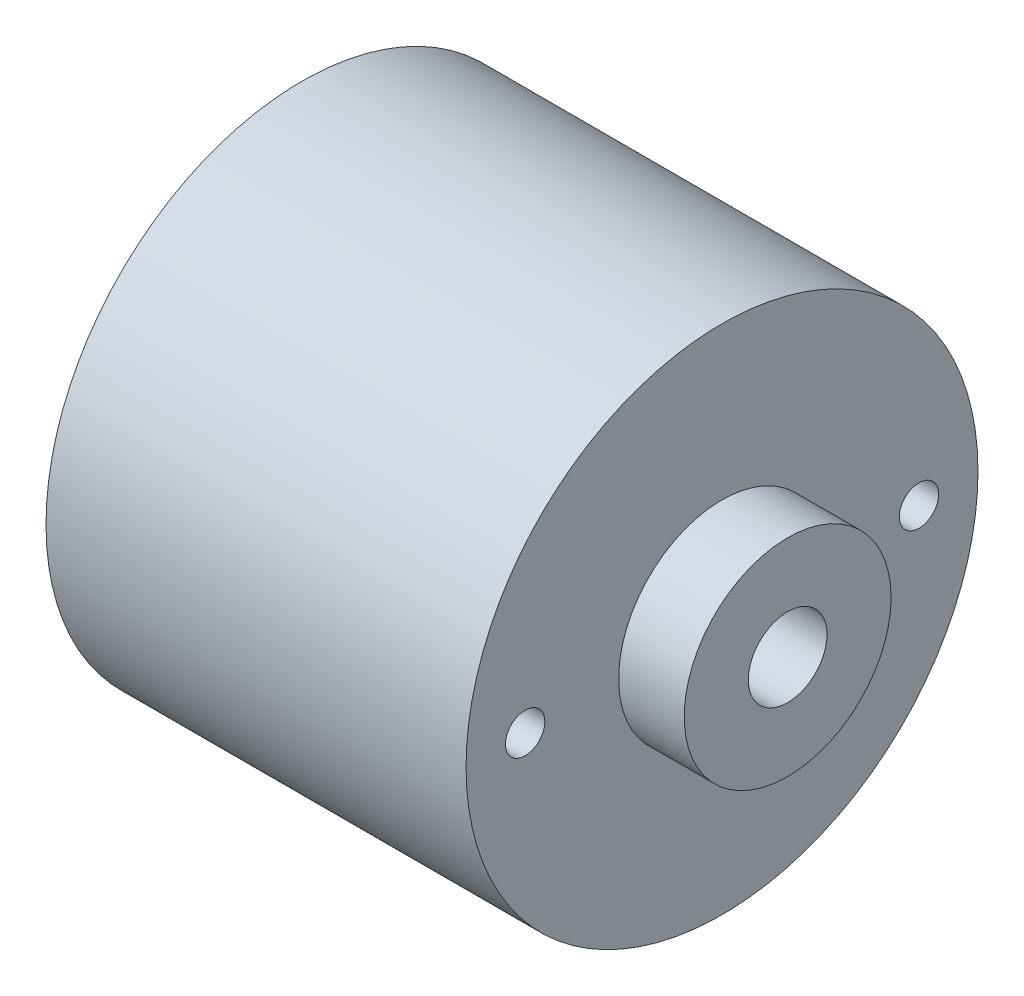
ISO-10303-21;
HEADER;
FILE_DESCRIPTION(('STEP AP214'),'2;1');
FILE_NAME('part.step','',(''),(''),'','','');
FILE_SCHEMA(('AUTOMOTIVE_DESIGN { 1 0 10303 214 1 1 1 1 }'));
ENDSEC;
DATA;
#1=APPLICATION_CONTEXT('core data for automotive mechanical design processes');
#2=APPLICATION_PROTOCOL_DEFINITION('international standard','automotive_design',2000,#1);
#3=PRODUCT_CONTEXT('',#1,'mechanical');
#4=PRODUCT('Part','Part','',(#3));
#5=PRODUCT_RELATED_PRODUCT_CATEGORY('part','',(#4));
#6=PRODUCT_DEFINITION_FORMATION('','',#4);
#7=PRODUCT_DEFINITION_CONTEXT('part definition',#1,'design');
#8=PRODUCT_DEFINITION('design','',#6,#7);
#9=PRODUCT_DEFINITION_SHAPE('','',#8);
#10=(LENGTH_UNIT() NAMED_UNIT(*) SI_UNIT(.MILLI.,.METRE.));
#11=(NAMED_UNIT(*) PLANE_ANGLE_UNIT() SI_UNIT($,.RADIAN.));
#12=(NAMED_UNIT(*) SI_UNIT($,.STERADIAN.) SOLID_ANGLE_UNIT());
#13=UNCERTAINTY_MEASURE_WITH_UNIT(LENGTH_MEASURE(1.E-05),#10,'distance_accuracy_value','');
#14=(GEOMETRIC_REPRESENTATION_CONTEXT(3) GLOBAL_UNCERTAINTY_ASSIGNED_CONTEXT((#13)) GLOBAL_UNIT_ASSIGNED_CONTEXT((#10,
#11,#12)) REPRESENTATION_CONTEXT('',''));
#15=CARTESIAN_POINT('',(0.,0.,0.));
#16=DIRECTION('',(0.,0.,1.));
#17=DIRECTION('',(1.,0.,0.));
#18=AXIS2_PLACEMENT_3D('',#15,#16,#17);
#19=CARTESIAN_POINT('',(32.,0.,0.));
#20=DIRECTION('',(-1.,0.,0.));
#21=DIRECTION('',(0.,0.,1.));
#22=AXIS2_PLACEMENT_3D('',#19,#20,#21);
#23=CYLINDRICAL_SURFACE('',#22,19.5);
#24=CARTESIAN_POINT('',(32.,0.,0.));
#25=DIRECTION('',(1.,0.,0.));
#26=DIRECTION('',(0.,0.,-1.));
#27=AXIS2_PLACEMENT_3D('',#24,#25,#26);
#28=CIRCLE('',#27,19.5);
#29=CARTESIAN_POINT('',(32.,0.,-19.5));
#30=VERTEX_POINT('',#29);
#31=EDGE_CURVE('E42',#30,#30,#28,.T.);
#32=ORIENTED_EDGE('',*,*,#31,.F.);
#33=EDGE_LOOP('',(#32));
#34=FACE_BOUND('',#33,.T.);
#35=CARTESIAN_POINT('',(0.,0.,0.));
#36=DIRECTION('',(1.,0.,0.));
#37=DIRECTION('',(0.,0.,-1.));
#38=AXIS2_PLACEMENT_3D('',#35,#36,#37);
#39=CIRCLE('',#38,19.5);
#40=CARTESIAN_POINT('',(0.,0.,-19.5));
#41=VERTEX_POINT('',#40);
#42=EDGE_CURVE('E38',#41,#41,#39,.T.);
#43=ORIENTED_EDGE('',*,*,#42,.T.);
#44=EDGE_LOOP('',(#43));
#45=FACE_BOUND('',#44,.T.);
#46=ADVANCED_FACE('F35',(#34,#45),#23,.T.);
#47=CARTESIAN_POINT('',(32.,0.,0.));
#48=DIRECTION('',(1.,0.,0.));
#49=DIRECTION('',(0.,0.,-1.));
#50=AXIS2_PLACEMENT_3D('',#47,#48,#49);
#51=PLANE('',#50);
#52=CARTESIAN_POINT('',(32.,0.,-15.));
#53=DIRECTION('',(1.,0.,0.));
#54=DIRECTION('',(0.,0.,-1.));
#55=AXIS2_PLACEMENT_3D('',#52,#53,#54);
#56=CIRCLE('',#55,1.5);
#57=CARTESIAN_POINT('',(32.,0.,-16.5));
#58=VERTEX_POINT('',#57);
#59=EDGE_CURVE('E64',#58,#58,#56,.T.);
#60=ORIENTED_EDGE('',*,*,#59,.F.);
#61=EDGE_LOOP('',(#60));
#62=FACE_BOUND('',#61,.T.);
#63=CARTESIAN_POINT('',(32.,0.,15.));
#64=DIRECTION('',(1.,0.,0.));
#65=DIRECTION('',(0.,0.,-1.));
#66=AXIS2_PLACEMENT_3D('',#63,#64,#65);
#67=CIRCLE('',#66,1.5);
#68=CARTESIAN_POINT('',(32.,0.,13.5));
#69=VERTEX_POINT('',#68);
#70=EDGE_CURVE('E58',#69,#69,#67,.T.);
#71=ORIENTED_EDGE('',*,*,#70,.F.);
#72=EDGE_LOOP('',(#71));
#73=FACE_BOUND('',#72,.T.);
#74=CARTESIAN_POINT('',(32.,0.,0.));
#75=DIRECTION('',(1.,0.,0.));
#76=DIRECTION('',(0.,0.,-1.));
#77=AXIS2_PLACEMENT_3D('',#74,#75,#76);
#78=CIRCLE('',#77,7.88);
#79=CARTESIAN_POINT('',(32.,0.,-7.88));
#80=VERTEX_POINT('',#79);
#81=EDGE_CURVE('E10',#80,#80,#78,.T.);
#82=ORIENTED_EDGE('',*,*,#81,.F.);
#83=EDGE_LOOP('',(#82));
#84=FACE_BOUND('',#83,.T.);
#85=ORIENTED_EDGE('',*,*,#31,.T.);
#86=EDGE_LOOP('',(#85));
#87=FACE_BOUND('',#86,.T.);
#88=ADVANCED_FACE('F79',(#62,#73,#84,#87),#51,.T.);
#89=CARTESIAN_POINT('',(0.,0.,0.));
#90=DIRECTION('',(1.,0.,0.));
#91=DIRECTION('',(0.,0.,-1.));
#92=AXIS2_PLACEMENT_3D('',#89,#90,#91);
#93=PLANE('',#92);
#94=CARTESIAN_POINT('',(0.,0.,0.));
#95=DIRECTION('',(1.,0.,0.));
#96=DIRECTION('',(0.,0.,-1.));
#97=AXIS2_PLACEMENT_3D('',#94,#95,#96);
#98=CIRCLE('',#97,3.);
#99=CARTESIAN_POINT('',(0.,0.,-3.));
#100=VERTEX_POINT('',#99);
#101=EDGE_CURVE('E51',#100,#100,#98,.F.);
#102=ORIENTED_EDGE('',*,*,#101,.F.);
#103=EDGE_LOOP('',(#102));
#104=FACE_BOUND('',#103,.T.);
#105=ORIENTED_EDGE('',*,*,#42,.F.);
#106=EDGE_LOOP('',(#105));
#107=FACE_BOUND('',#106,.T.);
#108=ADVANCED_FACE('F82',(#104,#107),#93,.F.);
#109=CARTESIAN_POINT('',(37.,0.,0.));
#110=DIRECTION('',(-1.,0.,0.));
#111=DIRECTION('',(0.,0.,1.));
#112=AXIS2_PLACEMENT_3D('',#109,#110,#111);
#113=CYLINDRICAL_SURFACE('',#112,7.88);
#114=CARTESIAN_POINT('',(37.,0.,0.));
#115=DIRECTION('',(1.,0.,0.));
#116=DIRECTION('',(0.,0.,-1.));
#117=AXIS2_PLACEMENT_3D('',#114,#115,#116);
#118=CIRCLE('',#117,7.88);
#119=CARTESIAN_POINT('',(37.,0.,-7.88));
#120=VERTEX_POINT('',#119);
#121=EDGE_CURVE('E48',#120,#120,#118,.T.);
#122=ORIENTED_EDGE('',*,*,#121,.F.);
#123=EDGE_LOOP('',(#122));
#124=FACE_BOUND('',#123,.T.);
#125=ORIENTED_EDGE('',*,*,#81,.T.);
#126=EDGE_LOOP('',(#125));
#127=FACE_BOUND('',#126,.T.);
#128=ADVANCED_FACE('F95',(#124,#127),#113,.T.);
#129=CARTESIAN_POINT('',(37.,0.,0.));
#130=DIRECTION('',(1.,0.,0.));
#131=DIRECTION('',(0.,0.,-1.));
#132=AXIS2_PLACEMENT_3D('',#129,#130,#131);
#133=PLANE('',#132);
#134=CARTESIAN_POINT('',(37.,0.,0.));
#135=DIRECTION('',(1.,0.,0.));
#136=DIRECTION('',(0.,0.,-1.));
#137=AXIS2_PLACEMENT_3D('',#134,#135,#136);
#138=CIRCLE('',#137,3.);
#139=CARTESIAN_POINT('',(37.,0.,-3.));
#140=VERTEX_POINT('',#139);
#141=EDGE_CURVE('E54',#140,#140,#138,.T.);
#142=ORIENTED_EDGE('',*,*,#141,.F.);
#143=EDGE_LOOP('',(#142));
#144=FACE_BOUND('',#143,.T.);
#145=ORIENTED_EDGE('',*,*,#121,.T.);
#146=EDGE_LOOP('',(#145));
#147=FACE_BOUND('',#146,.T.);
#148=ADVANCED_FACE('F100',(#144,#147),#133,.T.);
#149=CARTESIAN_POINT('',(-0.001000000000001,0.,0.));
#150=DIRECTION('',(1.,0.,0.));
#151=DIRECTION('',(0.,0.,-1.));
#152=AXIS2_PLACEMENT_3D('',#149,#150,#151);
#153=CYLINDRICAL_SURFACE('',#152,3.);
#154=ORIENTED_EDGE('',*,*,#141,.T.);
#155=EDGE_LOOP('',(#154));
#156=FACE_BOUND('',#155,.T.);
#157=ORIENTED_EDGE('',*,*,#101,.T.);
#158=EDGE_LOOP('',(#157));
#159=FACE_BOUND('',#158,.T.);
#160=ADVANCED_FACE('F107',(#156,#159),#153,.F.);
#161=CARTESIAN_POINT('',(22.,0.,15.));
#162=DIRECTION('',(1.,0.,0.));
#163=DIRECTION('',(0.,0.,-1.));
#164=AXIS2_PLACEMENT_3D('',#161,#162,#163);
#165=CYLINDRICAL_SURFACE('',#164,1.5);
#166=CARTESIAN_POINT('',(22.,0.,15.));
#167=DIRECTION('',(1.,0.,0.));
#168=DIRECTION('',(0.,0.,-1.));
#169=AXIS2_PLACEMENT_3D('',#166,#167,#168);
#170=CIRCLE('',#169,1.5);
#171=CARTESIAN_POINT('',(22.,0.,13.5));
#172=VERTEX_POINT('',#171);
#173=EDGE_CURVE('E61',#172,#172,#170,.T.);
#174=ORIENTED_EDGE('',*,*,#173,.F.);
#175=EDGE_LOOP('',(#174));
#176=FACE_BOUND('',#175,.T.);
#177=ORIENTED_EDGE('',*,*,#70,.T.);
#178=EDGE_LOOP('',(#177));
#179=FACE_BOUND('',#178,.T.);
#180=ADVANCED_FACE('F111',(#176,#179),#165,.F.);
#181=CARTESIAN_POINT('',(22.,0.,15.));
#182=DIRECTION('',(1.,0.,0.));
#183=DIRECTION('',(0.,0.,-1.));
#184=AXIS2_PLACEMENT_3D('',#181,#182,#183);
#185=PLANE('',#184);
#186=ORIENTED_EDGE('',*,*,#173,.T.);
#187=EDGE_LOOP('',(#186));
#188=FACE_BOUND('',#187,.T.);
#189=ADVANCED_FACE('F75',(#188),#185,.T.);
#190=CARTESIAN_POINT('',(22.,0.,-15.));
#191=DIRECTION('',(1.,0.,0.));
#192=DIRECTION('',(0.,0.,-1.));
#193=AXIS2_PLACEMENT_3D('',#190,#191,#192);
#194=CYLINDRICAL_SURFACE('',#193,1.5);
#195=CARTESIAN_POINT('',(22.,0.,-15.));
#196=DIRECTION('',(1.,0.,0.));
#197=DIRECTION('',(0.,0.,-1.));
#198=AXIS2_PLACEMENT_3D('',#195,#196,#197);
#199=CIRCLE('',#198,1.5);
#200=CARTESIAN_POINT('',(22.,0.,-16.5));
#201=VERTEX_POINT('',#200);
#202=EDGE_CURVE('E57',#201,#201,#199,.T.);
#203=ORIENTED_EDGE('',*,*,#202,.F.);
#204=EDGE_LOOP('',(#203));
#205=FACE_BOUND('',#204,.T.);
#206=ORIENTED_EDGE('',*,*,#59,.T.);
#207=EDGE_LOOP('',(#206));
#208=FACE_BOUND('',#207,.T.);
#209=ADVANCED_FACE('F72',(#205,#208),#194,.F.);
#210=CARTESIAN_POINT('',(22.,0.,-15.));
#211=DIRECTION('',(1.,0.,0.));
#212=DIRECTION('',(0.,0.,-1.));
#213=AXIS2_PLACEMENT_3D('',#210,#211,#212);
#214=PLANE('',#213);
#215=ORIENTED_EDGE('',*,*,#202,.T.);
#216=EDGE_LOOP('',(#215));
#217=FACE_BOUND('',#216,.T.);
#218=ADVANCED_FACE('F70',(#217),#214,.T.);
#219=CLOSED_SHELL('',(#46,#88,#108,#128,#148,#160,#180,#189,#209,#218));
#220=MANIFOLD_SOLID_BREP('B2',#219);
#221=ADVANCED_BREP_SHAPE_REPRESENTATION('',(#18,#220),#14);
#222=SHAPE_DEFINITION_REPRESENTATION(#9,#221);
ENDSEC;
END-ISO-10303-21;
